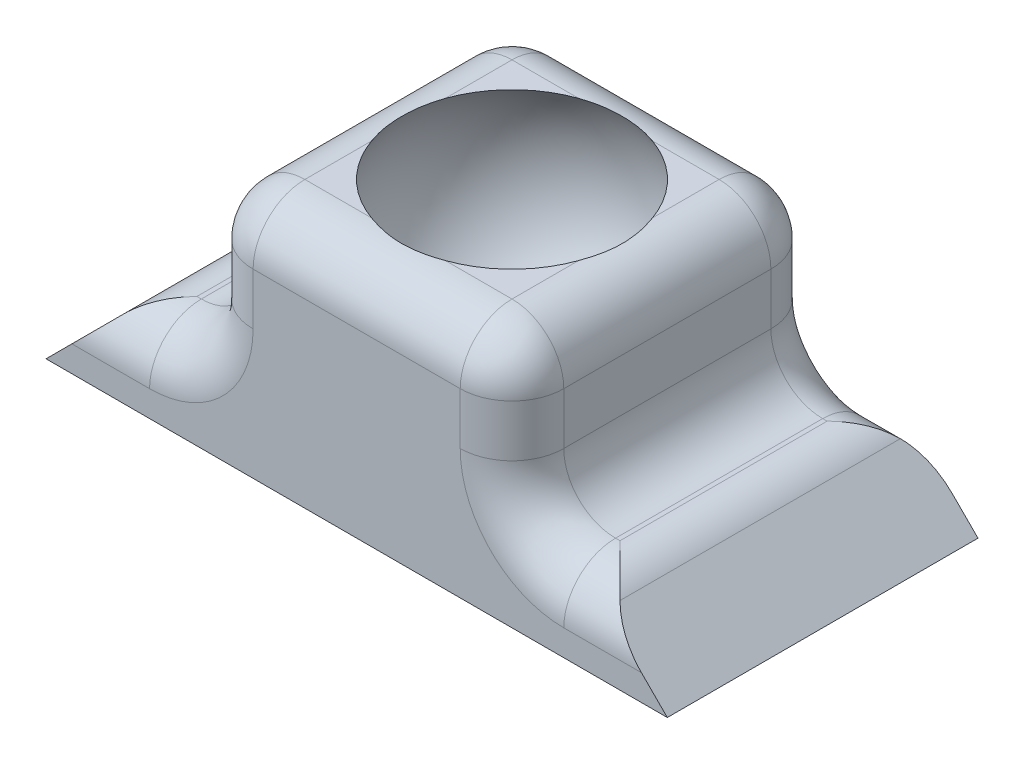
ISO-10303-21;
HEADER;
FILE_DESCRIPTION(('STEP AP214'),'2;1');
FILE_NAME('part.step','',(''),(''),'','','');
FILE_SCHEMA(('AUTOMOTIVE_DESIGN { 1 0 10303 214 1 1 1 1 }'));
ENDSEC;
DATA;
#1=APPLICATION_CONTEXT('core data for automotive mechanical design processes');
#2=APPLICATION_PROTOCOL_DEFINITION('international standard','automotive_design',2000,#1);
#3=PRODUCT_CONTEXT('',#1,'mechanical');
#4=PRODUCT('Part','Part','',(#3));
#5=PRODUCT_RELATED_PRODUCT_CATEGORY('part','',(#4));
#6=PRODUCT_DEFINITION_FORMATION('','',#4);
#7=PRODUCT_DEFINITION_CONTEXT('part definition',#1,'design');
#8=PRODUCT_DEFINITION('design','',#6,#7);
#9=PRODUCT_DEFINITION_SHAPE('','',#8);
#10=(LENGTH_UNIT() NAMED_UNIT(*) SI_UNIT(.MILLI.,.METRE.));
#11=(NAMED_UNIT(*) PLANE_ANGLE_UNIT() SI_UNIT($,.RADIAN.));
#12=(NAMED_UNIT(*) SI_UNIT($,.STERADIAN.) SOLID_ANGLE_UNIT());
#13=UNCERTAINTY_MEASURE_WITH_UNIT(LENGTH_MEASURE(1.E-05),#10,'distance_accuracy_value','');
#14=(GEOMETRIC_REPRESENTATION_CONTEXT(3) GLOBAL_UNCERTAINTY_ASSIGNED_CONTEXT((#13)) GLOBAL_UNIT_ASSIGNED_CONTEXT((#10,
#11,#12)) REPRESENTATION_CONTEXT('',''));
#15=CARTESIAN_POINT('',(0.,0.,0.));
#16=DIRECTION('',(0.,0.,1.));
#17=DIRECTION('',(1.,0.,0.));
#18=AXIS2_PLACEMENT_3D('',#15,#16,#17);
#19=CARTESIAN_POINT('',(0.,4.5,-3.));
#20=DIRECTION('',(0.,-1.,0.));
#21=DIRECTION('',(0.,0.,-1.));
#22=AXIS2_PLACEMENT_3D('',#19,#20,#21);
#23=PLANE('',#22);
#24=CARTESIAN_POINT('',(0.,4.5,0.));
#25=DIRECTION('',(0.,-1.,0.));
#26=DIRECTION('',(0.,0.,-1.));
#27=AXIS2_PLACEMENT_3D('',#24,#25,#26);
#28=CIRCLE('',#27,2.12367605815953);
#29=CARTESIAN_POINT('',(2.,4.5,-0.714142842854288));
#30=VERTEX_POINT('',#29);
#31=CARTESIAN_POINT('',(0.714142842854288,4.5,-2.));
#32=VERTEX_POINT('',#31);
#33=EDGE_CURVE('E248',#30,#32,#28,.F.);
#34=ORIENTED_EDGE('',*,*,#33,.F.);
#35=DIRECTION('',(0.,0.,1.));
#36=VECTOR('',#35,1.);
#37=CARTESIAN_POINT('',(2.,4.5,-3.));
#38=LINE('',#37,#36);
#39=CARTESIAN_POINT('',(2.,4.5,-2.));
#40=VERTEX_POINT('',#39);
#41=EDGE_CURVE('E56',#30,#40,#38,.F.);
#42=ORIENTED_EDGE('',*,*,#41,.T.);
#43=DIRECTION('',(1.,0.,0.));
#44=VECTOR('',#43,1.);
#45=CARTESIAN_POINT('',(0.,4.5,-2.));
#46=LINE('',#45,#44);
#47=EDGE_CURVE('E347',#40,#32,#46,.F.);
#48=ORIENTED_EDGE('',*,*,#47,.T.);
#49=EDGE_LOOP('',(#34,#42,#48));
#50=FACE_BOUND('',#49,.T.);
#51=ADVANCED_FACE('F39',(#50),#23,.F.);
#52=DIRECTION('',(1.,0.,0.));
#53=VECTOR('',#52,1.);
#54=CARTESIAN_POINT('',(3.,4.5,2.));
#55=LINE('',#54,#53);
#56=CARTESIAN_POINT('',(0.714142842854288,4.5,2.));
#57=VERTEX_POINT('',#56);
#58=CARTESIAN_POINT('',(2.,4.5,2.));
#59=VERTEX_POINT('',#58);
#60=EDGE_CURVE('E64',#57,#59,#55,.T.);
#61=ORIENTED_EDGE('',*,*,#60,.T.);
#62=DIRECTION('',(0.,0.,1.));
#63=VECTOR('',#62,1.);
#64=CARTESIAN_POINT('',(2.,4.5,-3.));
#65=LINE('',#64,#63);
#66=CARTESIAN_POINT('',(2.,4.5,0.714142842854288));
#67=VERTEX_POINT('',#66);
#68=EDGE_CURVE('E345',#59,#67,#65,.F.);
#69=ORIENTED_EDGE('',*,*,#68,.T.);
#70=EDGE_CURVE('E488',#57,#67,#28,.F.);
#71=ORIENTED_EDGE('',*,*,#70,.F.);
#72=EDGE_LOOP('',(#61,#69,#71));
#73=FACE_BOUND('',#72,.T.);
#74=ADVANCED_FACE('F531',(#73),#23,.F.);
#75=CARTESIAN_POINT('',(-0.714142842854288,4.5,-2.));
#76=VERTEX_POINT('',#75);
#77=CARTESIAN_POINT('',(-2.,4.5,-0.714142842854288));
#78=VERTEX_POINT('',#77);
#79=EDGE_CURVE('E243',#76,#78,#28,.F.);
#80=ORIENTED_EDGE('',*,*,#79,.F.);
#81=DIRECTION('',(1.,0.,0.));
#82=VECTOR('',#81,1.);
#83=CARTESIAN_POINT('',(0.,4.5,-2.));
#84=LINE('',#83,#82);
#85=CARTESIAN_POINT('',(-2.,4.5,-2.));
#86=VERTEX_POINT('',#85);
#87=EDGE_CURVE('E342',#76,#86,#84,.F.);
#88=ORIENTED_EDGE('',*,*,#87,.T.);
#89=DIRECTION('',(0.,0.,1.));
#90=VECTOR('',#89,1.);
#91=CARTESIAN_POINT('',(-2.,4.5,-3.));
#92=LINE('',#91,#90);
#93=EDGE_CURVE('E340',#86,#78,#92,.T.);
#94=ORIENTED_EDGE('',*,*,#93,.T.);
#95=EDGE_LOOP('',(#80,#88,#94));
#96=FACE_BOUND('',#95,.T.);
#97=ADVANCED_FACE('F507',(#96),#23,.F.);
#98=CARTESIAN_POINT('',(0.,0.,-3.));
#99=DIRECTION('',(0.,1.,0.));
#100=DIRECTION('',(0.,0.,1.));
#101=AXIS2_PLACEMENT_3D('',#98,#99,#100);
#102=PLANE('',#101);
#103=DIRECTION('',(0.,0.,1.));
#104=VECTOR('',#103,1.);
#105=CARTESIAN_POINT('',(6.,0.,-3.));
#106=LINE('',#105,#104);
#107=CARTESIAN_POINT('',(6.,0.,-3.));
#108=VERTEX_POINT('',#107);
#109=CARTESIAN_POINT('',(6.,0.,3.));
#110=VERTEX_POINT('',#109);
#111=EDGE_CURVE('E216',#108,#110,#106,.T.);
#112=ORIENTED_EDGE('',*,*,#111,.T.);
#113=DIRECTION('',(-1.,0.,0.));
#114=VECTOR('',#113,1.);
#115=CARTESIAN_POINT('',(0.,0.,3.));
#116=LINE('',#115,#114);
#117=CARTESIAN_POINT('',(-6.,0.,3.));
#118=VERTEX_POINT('',#117);
#119=EDGE_CURVE('E221',#110,#118,#116,.T.);
#120=ORIENTED_EDGE('',*,*,#119,.T.);
#121=DIRECTION('',(0.,0.,1.));
#122=VECTOR('',#121,1.);
#123=CARTESIAN_POINT('',(-6.,0.,-3.));
#124=LINE('',#123,#122);
#125=CARTESIAN_POINT('',(-6.,0.,-3.));
#126=VERTEX_POINT('',#125);
#127=EDGE_CURVE('E228',#126,#118,#124,.T.);
#128=ORIENTED_EDGE('',*,*,#127,.F.);
#129=DIRECTION('',(-1.,0.,0.));
#130=VECTOR('',#129,1.);
#131=CARTESIAN_POINT('',(0.,0.,-3.));
#132=LINE('',#131,#130);
#133=EDGE_CURVE('E224',#108,#126,#132,.T.);
#134=ORIENTED_EDGE('',*,*,#133,.F.);
#135=EDGE_LOOP('',(#112,#120,#128,#134));
#136=FACE_BOUND('',#135,.T.);
#137=ADVANCED_FACE('F218',(#136),#102,.F.);
#138=CARTESIAN_POINT('',(-2.99999999999997,3.,-3.));
#139=DIRECTION('',(0.707106781186544,-0.707106781186551,0.));
#140=DIRECTION('',(0.707106781186551,0.707106781186544,0.));
#141=AXIS2_PLACEMENT_3D('',#138,#139,#140);
#142=PLANE('',#141);
#143=DIRECTION('',(0.707106781186551,0.707106781186544,0.));
#144=VECTOR('',#143,1.);
#145=CARTESIAN_POINT('',(-2.99999999999997,3.,3.));
#146=LINE('',#145,#144);
#147=CARTESIAN_POINT('',(-5.5,0.499999999999998,3.));
#148=VERTEX_POINT('',#147);
#149=EDGE_CURVE('E238',#118,#148,#146,.T.);
#150=ORIENTED_EDGE('',*,*,#149,.T.);
#151=CARTESIAN_POINT('',(-5.5,0.499999999999999,2.));
#152=DIRECTION('',(0.707106781186544,-0.707106781186551,0.));
#153=DIRECTION('',(-0.707106781186551,-0.707106781186544,0.));
#154=AXIS2_PLACEMENT_3D('',#151,#152,#153);
#155=ELLIPSE('',#154,1.4142135623731,1.);
#156=CARTESIAN_POINT('',(-4.79289321881344,1.20710678118655,2.70710678118654));
#157=VERTEX_POINT('',#156);
#158=EDGE_CURVE('E286',#148,#157,#155,.F.);
#159=ORIENTED_EDGE('',*,*,#158,.T.);
#160=DIRECTION('',(0.,0.,1.));
#161=VECTOR('',#160,1.);
#162=CARTESIAN_POINT('',(-4.79289321881344,1.20710678118655,-3.));
#163=LINE('',#162,#161);
#164=CARTESIAN_POINT('',(-4.79289321881344,1.20710678118655,-2.70710678118654));
#165=VERTEX_POINT('',#164);
#166=EDGE_CURVE('E282',#157,#165,#163,.F.);
#167=ORIENTED_EDGE('',*,*,#166,.T.);
#168=CARTESIAN_POINT('',(-5.5,0.499999999999999,-2.));
#169=DIRECTION('',(0.707106781186544,-0.707106781186551,0.));
#170=DIRECTION('',(0.707106781186551,0.707106781186544,0.));
#171=AXIS2_PLACEMENT_3D('',#168,#169,#170);
#172=ELLIPSE('',#171,1.4142135623731,1.);
#173=CARTESIAN_POINT('',(-5.5,0.499999999999998,-3.));
#174=VERTEX_POINT('',#173);
#175=EDGE_CURVE('E284',#165,#174,#172,.F.);
#176=ORIENTED_EDGE('',*,*,#175,.T.);
#177=DIRECTION('',(0.707106781186551,0.707106781186544,0.));
#178=VECTOR('',#177,1.);
#179=CARTESIAN_POINT('',(-2.99999999999997,3.,-3.));
#180=LINE('',#179,#178);
#181=EDGE_CURVE('E229',#126,#174,#180,.T.);
#182=ORIENTED_EDGE('',*,*,#181,.F.);
#183=ORIENTED_EDGE('',*,*,#127,.T.);
#184=EDGE_LOOP('',(#150,#159,#167,#176,#182,#183));
#185=FACE_BOUND('',#184,.T.);
#186=ADVANCED_FACE('F537',(#185),#142,.F.);
#187=CARTESIAN_POINT('',(0.,1.5,-3.));
#188=DIRECTION('',(0.,-1.,0.));
#189=DIRECTION('',(1.,0.,0.));
#190=AXIS2_PLACEMENT_3D('',#187,#188,#189);
#191=PLANE('',#190);
#192=DIRECTION('',(1.,0.,0.));
#193=VECTOR('',#192,1.);
#194=CARTESIAN_POINT('',(0.,1.5,-2.));
#195=LINE('',#194,#193);
#196=CARTESIAN_POINT('',(-4.,1.5,-2.));
#197=VERTEX_POINT('',#196);
#198=CARTESIAN_POINT('',(-4.08578643762689,1.5,-2.));
#199=VERTEX_POINT('',#198);
#200=EDGE_CURVE('E259',#197,#199,#195,.F.);
#201=ORIENTED_EDGE('',*,*,#200,.T.);
#202=DIRECTION('',(0.,0.,1.));
#203=VECTOR('',#202,1.);
#204=CARTESIAN_POINT('',(-4.08578643762689,1.5,-3.));
#205=LINE('',#204,#203);
#206=CARTESIAN_POINT('',(-4.08578643762689,1.5,2.));
#207=VERTEX_POINT('',#206);
#208=EDGE_CURVE('E264',#199,#207,#205,.T.);
#209=ORIENTED_EDGE('',*,*,#208,.T.);
#210=DIRECTION('',(1.,0.,0.));
#211=VECTOR('',#210,1.);
#212=CARTESIAN_POINT('',(-3.,1.5,2.));
#213=LINE('',#212,#211);
#214=CARTESIAN_POINT('',(-4.,1.5,2.));
#215=VERTEX_POINT('',#214);
#216=EDGE_CURVE('E261',#207,#215,#213,.T.);
#217=ORIENTED_EDGE('',*,*,#216,.T.);
#218=DIRECTION('',(0.,0.,1.));
#219=VECTOR('',#218,1.);
#220=CARTESIAN_POINT('',(-4.,1.5,-3.));
#221=LINE('',#220,#219);
#222=EDGE_CURVE('E256',#215,#197,#221,.F.);
#223=ORIENTED_EDGE('',*,*,#222,.T.);
#224=EDGE_LOOP('',(#201,#209,#217,#223));
#225=FACE_BOUND('',#224,.T.);
#226=ADVANCED_FACE('F527',(#225),#191,.F.);
#227=CARTESIAN_POINT('',(-3.,0.,-3.));
#228=DIRECTION('',(1.,0.,0.));
#229=DIRECTION('',(0.,0.,-1.));
#230=AXIS2_PLACEMENT_3D('',#227,#228,#229);
#231=PLANE('',#230);
#232=DIRECTION('',(0.,1.,0.));
#233=VECTOR('',#232,1.);
#234=CARTESIAN_POINT('',(-3.,0.,-2.));
#235=LINE('',#234,#233);
#236=CARTESIAN_POINT('',(-3.,3.5,-2.));
#237=VERTEX_POINT('',#236);
#238=CARTESIAN_POINT('',(-3.,2.5,-2.));
#239=VERTEX_POINT('',#238);
#240=EDGE_CURVE('E320',#237,#239,#235,.F.);
#241=ORIENTED_EDGE('',*,*,#240,.T.);
#242=DIRECTION('',(0.,0.,1.));
#243=VECTOR('',#242,1.);
#244=CARTESIAN_POINT('',(-3.,2.5,3.));
#245=LINE('',#244,#243);
#246=CARTESIAN_POINT('',(-3.,2.5,2.));
#247=VERTEX_POINT('',#246);
#248=EDGE_CURVE('E325',#239,#247,#245,.T.);
#249=ORIENTED_EDGE('',*,*,#248,.T.);
#250=DIRECTION('',(0.,1.,0.));
#251=VECTOR('',#250,1.);
#252=CARTESIAN_POINT('',(-3.,4.5,2.));
#253=LINE('',#252,#251);
#254=CARTESIAN_POINT('',(-3.,3.5,2.));
#255=VERTEX_POINT('',#254);
#256=EDGE_CURVE('E322',#247,#255,#253,.T.);
#257=ORIENTED_EDGE('',*,*,#256,.T.);
#258=DIRECTION('',(0.,0.,1.));
#259=VECTOR('',#258,1.);
#260=CARTESIAN_POINT('',(-3.,3.5,-3.));
#261=LINE('',#260,#259);
#262=EDGE_CURVE('E318',#255,#237,#261,.F.);
#263=ORIENTED_EDGE('',*,*,#262,.T.);
#264=EDGE_LOOP('',(#241,#249,#257,#263));
#265=FACE_BOUND('',#264,.T.);
#266=ADVANCED_FACE('F518',(#265),#231,.F.);
#267=DIRECTION('',(0.,0.,1.));
#268=VECTOR('',#267,1.);
#269=CARTESIAN_POINT('',(-2.,4.5,-3.));
#270=LINE('',#269,#268);
#271=CARTESIAN_POINT('',(-2.,4.5,0.714142842854288));
#272=VERTEX_POINT('',#271);
#273=CARTESIAN_POINT('',(-2.,4.5,2.));
#274=VERTEX_POINT('',#273);
#275=EDGE_CURVE('E336',#272,#274,#270,.T.);
#276=ORIENTED_EDGE('',*,*,#275,.T.);
#277=DIRECTION('',(1.,0.,0.));
#278=VECTOR('',#277,1.);
#279=CARTESIAN_POINT('',(3.,4.5,2.));
#280=LINE('',#279,#278);
#281=CARTESIAN_POINT('',(-0.714142842854288,4.5,2.));
#282=VERTEX_POINT('',#281);
#283=EDGE_CURVE('E338',#274,#282,#280,.T.);
#284=ORIENTED_EDGE('',*,*,#283,.T.);
#285=EDGE_CURVE('E246',#272,#282,#28,.F.);
#286=ORIENTED_EDGE('',*,*,#285,.F.);
#287=EDGE_LOOP('',(#276,#284,#286));
#288=FACE_BOUND('',#287,.T.);
#289=ADVANCED_FACE('F515',(#288),#23,.F.);
#290=CARTESIAN_POINT('',(3.,0.,-3.));
#291=DIRECTION('',(1.,0.,0.));
#292=DIRECTION('',(0.,0.,-1.));
#293=AXIS2_PLACEMENT_3D('',#290,#291,#292);
#294=PLANE('',#293);
#295=DIRECTION('',(0.,1.,0.));
#296=VECTOR('',#295,1.);
#297=CARTESIAN_POINT('',(3.,0.,2.));
#298=LINE('',#297,#296);
#299=CARTESIAN_POINT('',(3.,3.5,2.));
#300=VERTEX_POINT('',#299);
#301=CARTESIAN_POINT('',(3.,2.5,2.));
#302=VERTEX_POINT('',#301);
#303=EDGE_CURVE('E331',#300,#302,#298,.F.);
#304=ORIENTED_EDGE('',*,*,#303,.T.);
#305=DIRECTION('',(0.,0.,1.));
#306=VECTOR('',#305,1.);
#307=CARTESIAN_POINT('',(3.,2.5,-3.));
#308=LINE('',#307,#306);
#309=CARTESIAN_POINT('',(3.,2.5,-2.));
#310=VERTEX_POINT('',#309);
#311=EDGE_CURVE('E334',#302,#310,#308,.F.);
#312=ORIENTED_EDGE('',*,*,#311,.T.);
#313=DIRECTION('',(0.,1.,0.));
#314=VECTOR('',#313,1.);
#315=CARTESIAN_POINT('',(3.,4.5,-2.));
#316=LINE('',#315,#314);
#317=CARTESIAN_POINT('',(3.,3.5,-2.));
#318=VERTEX_POINT('',#317);
#319=EDGE_CURVE('E329',#310,#318,#316,.T.);
#320=ORIENTED_EDGE('',*,*,#319,.T.);
#321=DIRECTION('',(0.,0.,1.));
#322=VECTOR('',#321,1.);
#323=CARTESIAN_POINT('',(3.,3.5,3.));
#324=LINE('',#323,#322);
#325=EDGE_CURVE('E327',#318,#300,#324,.T.);
#326=ORIENTED_EDGE('',*,*,#325,.T.);
#327=EDGE_LOOP('',(#304,#312,#320,#326));
#328=FACE_BOUND('',#327,.T.);
#329=ADVANCED_FACE('F517',(#328),#294,.T.);
#330=CARTESIAN_POINT('',(0.,1.5,-3.));
#331=DIRECTION('',(0.,1.,0.));
#332=DIRECTION('',(0.,0.,1.));
#333=AXIS2_PLACEMENT_3D('',#330,#331,#332);
#334=PLANE('',#333);
#335=DIRECTION('',(-1.,0.,0.));
#336=VECTOR('',#335,1.);
#337=CARTESIAN_POINT('',(0.,1.5,2.));
#338=LINE('',#337,#336);
#339=CARTESIAN_POINT('',(4.,1.5,2.));
#340=VERTEX_POINT('',#339);
#341=CARTESIAN_POINT('',(4.08578643762689,1.5,2.));
#342=VERTEX_POINT('',#341);
#343=EDGE_CURVE('E292',#340,#342,#338,.F.);
#344=ORIENTED_EDGE('',*,*,#343,.T.);
#345=DIRECTION('',(0.,0.,1.));
#346=VECTOR('',#345,1.);
#347=CARTESIAN_POINT('',(4.08578643762689,1.5,-3.));
#348=LINE('',#347,#346);
#349=CARTESIAN_POINT('',(4.08578643762689,1.5,-2.));
#350=VERTEX_POINT('',#349);
#351=EDGE_CURVE('E295',#342,#350,#348,.F.);
#352=ORIENTED_EDGE('',*,*,#351,.T.);
#353=DIRECTION('',(-1.,0.,0.));
#354=VECTOR('',#353,1.);
#355=CARTESIAN_POINT('',(3.,1.5,-2.));
#356=LINE('',#355,#354);
#357=CARTESIAN_POINT('',(4.,1.5,-2.));
#358=VERTEX_POINT('',#357);
#359=EDGE_CURVE('E290',#350,#358,#356,.T.);
#360=ORIENTED_EDGE('',*,*,#359,.T.);
#361=DIRECTION('',(0.,0.,1.));
#362=VECTOR('',#361,1.);
#363=CARTESIAN_POINT('',(4.,1.5,3.));
#364=LINE('',#363,#362);
#365=EDGE_CURVE('E288',#358,#340,#364,.T.);
#366=ORIENTED_EDGE('',*,*,#365,.T.);
#367=EDGE_LOOP('',(#344,#352,#360,#366));
#368=FACE_BOUND('',#367,.T.);
#369=ADVANCED_FACE('F524',(#368),#334,.T.);
#370=CARTESIAN_POINT('',(2.99999999999997,3.,-3.));
#371=DIRECTION('',(0.707106781186544,0.707106781186551,0.));
#372=DIRECTION('',(-0.707106781186551,0.707106781186544,0.));
#373=AXIS2_PLACEMENT_3D('',#370,#371,#372);
#374=PLANE('',#373);
#375=DIRECTION('',(0.,0.,1.));
#376=VECTOR('',#375,1.);
#377=CARTESIAN_POINT('',(4.79289321881344,1.20710678118655,-3.));
#378=LINE('',#377,#376);
#379=CARTESIAN_POINT('',(4.79289321881344,1.20710678118655,-2.70710678118654));
#380=VERTEX_POINT('',#379);
#381=CARTESIAN_POINT('',(4.79289321881344,1.20710678118655,2.70710678118654));
#382=VERTEX_POINT('',#381);
#383=EDGE_CURVE('E297',#380,#382,#378,.T.);
#384=ORIENTED_EDGE('',*,*,#383,.T.);
#385=CARTESIAN_POINT('',(5.49999999999999,0.499999999999999,2.));
#386=DIRECTION('',(0.707106781186544,0.707106781186551,0.));
#387=DIRECTION('',(-0.707106781186551,0.707106781186544,0.));
#388=AXIS2_PLACEMENT_3D('',#385,#386,#387);
#389=ELLIPSE('',#388,1.4142135623731,1.);
#390=CARTESIAN_POINT('',(5.49999999999999,0.499999999999999,3.));
#391=VERTEX_POINT('',#390);
#392=EDGE_CURVE('E235',#382,#391,#389,.T.);
#393=ORIENTED_EDGE('',*,*,#392,.T.);
#394=DIRECTION('',(-0.707106781186551,0.707106781186544,0.));
#395=VECTOR('',#394,1.);
#396=CARTESIAN_POINT('',(2.99999999999997,3.,3.));
#397=LINE('',#396,#395);
#398=EDGE_CURVE('E232',#110,#391,#397,.T.);
#399=ORIENTED_EDGE('',*,*,#398,.F.);
#400=ORIENTED_EDGE('',*,*,#111,.F.);
#401=DIRECTION('',(-0.707106781186551,0.707106781186544,0.));
#402=VECTOR('',#401,1.);
#403=CARTESIAN_POINT('',(2.99999999999997,3.,-3.));
#404=LINE('',#403,#402);
#405=CARTESIAN_POINT('',(5.49999999999999,0.499999999999999,-3.));
#406=VERTEX_POINT('',#405);
#407=EDGE_CURVE('E252',#108,#406,#404,.T.);
#408=ORIENTED_EDGE('',*,*,#407,.T.);
#409=CARTESIAN_POINT('',(5.49999999999999,0.499999999999999,-2.));
#410=DIRECTION('',(0.707106781186544,0.707106781186551,0.));
#411=DIRECTION('',(0.707106781186551,-0.707106781186544,0.));
#412=AXIS2_PLACEMENT_3D('',#409,#410,#411);
#413=ELLIPSE('',#412,1.4142135623731,1.);
#414=EDGE_CURVE('E299',#406,#380,#413,.T.);
#415=ORIENTED_EDGE('',*,*,#414,.T.);
#416=EDGE_LOOP('',(#384,#393,#399,#400,#408,#415));
#417=FACE_BOUND('',#416,.T.);
#418=ADVANCED_FACE('F233',(#417),#374,.T.);
#419=CARTESIAN_POINT('',(0.,0.,-3.));
#420=DIRECTION('',(0.,0.,1.));
#421=DIRECTION('',(1.,0.,0.));
#422=AXIS2_PLACEMENT_3D('',#419,#420,#421);
#423=PLANE('',#422);
#424=CARTESIAN_POINT('',(4.,2.5,-3.));
#425=DIRECTION('',(0.,0.,1.));
#426=DIRECTION('',(1.,0.,0.));
#427=AXIS2_PLACEMENT_3D('',#424,#425,#426);
#428=CIRCLE('',#427,2.);
#429=CARTESIAN_POINT('',(4.,0.499999999999999,-3.));
#430=VERTEX_POINT('',#429);
#431=CARTESIAN_POINT('',(2.,2.5,-3.));
#432=VERTEX_POINT('',#431);
#433=EDGE_CURVE('E313',#430,#432,#428,.F.);
#434=ORIENTED_EDGE('',*,*,#433,.F.);
#435=DIRECTION('',(-1.,0.,0.));
#436=VECTOR('',#435,1.);
#437=CARTESIAN_POINT('',(4.49999999999998,0.499999999999999,-3.));
#438=LINE('',#437,#436);
#439=EDGE_CURVE('E316',#430,#406,#438,.F.);
#440=ORIENTED_EDGE('',*,*,#439,.T.);
#441=ORIENTED_EDGE('',*,*,#407,.F.);
#442=ORIENTED_EDGE('',*,*,#133,.T.);
#443=ORIENTED_EDGE('',*,*,#181,.T.);
#444=DIRECTION('',(1.,0.,0.));
#445=VECTOR('',#444,1.);
#446=CARTESIAN_POINT('',(0.,0.5,-3.));
#447=LINE('',#446,#445);
#448=CARTESIAN_POINT('',(-4.,0.499999999999999,-3.));
#449=VERTEX_POINT('',#448);
#450=EDGE_CURVE('E311',#174,#449,#447,.T.);
#451=ORIENTED_EDGE('',*,*,#450,.T.);
#452=CARTESIAN_POINT('',(-4.,2.5,-3.));
#453=DIRECTION('',(0.,0.,1.));
#454=DIRECTION('',(1.,0.,0.));
#455=AXIS2_PLACEMENT_3D('',#452,#453,#454);
#456=CIRCLE('',#455,2.);
#457=CARTESIAN_POINT('',(-2.,2.5,-3.));
#458=VERTEX_POINT('',#457);
#459=EDGE_CURVE('E308',#458,#449,#456,.F.);
#460=ORIENTED_EDGE('',*,*,#459,.F.);
#461=DIRECTION('',(0.,1.,0.));
#462=VECTOR('',#461,1.);
#463=CARTESIAN_POINT('',(-2.,0.,-3.));
#464=LINE('',#463,#462);
#465=CARTESIAN_POINT('',(-2.,3.5,-3.));
#466=VERTEX_POINT('',#465);
#467=EDGE_CURVE('E304',#458,#466,#464,.T.);
#468=ORIENTED_EDGE('',*,*,#467,.T.);
#469=DIRECTION('',(1.,0.,0.));
#470=VECTOR('',#469,1.);
#471=CARTESIAN_POINT('',(0.,3.5,-3.));
#472=LINE('',#471,#470);
#473=CARTESIAN_POINT('',(2.,3.5,-3.));
#474=VERTEX_POINT('',#473);
#475=EDGE_CURVE('E302',#466,#474,#472,.T.);
#476=ORIENTED_EDGE('',*,*,#475,.T.);
#477=DIRECTION('',(0.,1.,0.));
#478=VECTOR('',#477,1.);
#479=CARTESIAN_POINT('',(2.,1.5,-3.));
#480=LINE('',#479,#478);
#481=EDGE_CURVE('E306',#474,#432,#480,.F.);
#482=ORIENTED_EDGE('',*,*,#481,.T.);
#483=EDGE_LOOP('',(#434,#440,#441,#442,#443,#451,#460,#468,#476,#482));
#484=FACE_BOUND('',#483,.T.);
#485=ADVANCED_FACE('F600',(#484),#423,.F.);
#486=CARTESIAN_POINT('',(0.,0.,3.));
#487=DIRECTION('',(0.,0.,1.));
#488=DIRECTION('',(1.,0.,0.));
#489=AXIS2_PLACEMENT_3D('',#486,#487,#488);
#490=PLANE('',#489);
#491=CARTESIAN_POINT('',(-4.,2.5,3.));
#492=DIRECTION('',(0.,0.,1.));
#493=DIRECTION('',(1.,0.,0.));
#494=AXIS2_PLACEMENT_3D('',#491,#492,#493);
#495=CIRCLE('',#494,2.);
#496=CARTESIAN_POINT('',(-4.,0.499999999999999,3.));
#497=VERTEX_POINT('',#496);
#498=CARTESIAN_POINT('',(-2.,2.5,3.));
#499=VERTEX_POINT('',#498);
#500=EDGE_CURVE('E277',#497,#499,#495,.T.);
#501=ORIENTED_EDGE('',*,*,#500,.F.);
#502=DIRECTION('',(1.,0.,0.));
#503=VECTOR('',#502,1.);
#504=CARTESIAN_POINT('',(-4.49999999999998,0.499999999999999,3.));
#505=LINE('',#504,#503);
#506=EDGE_CURVE('E280',#497,#148,#505,.F.);
#507=ORIENTED_EDGE('',*,*,#506,.T.);
#508=ORIENTED_EDGE('',*,*,#149,.F.);
#509=ORIENTED_EDGE('',*,*,#119,.F.);
#510=ORIENTED_EDGE('',*,*,#398,.T.);
#511=DIRECTION('',(-1.,0.,0.));
#512=VECTOR('',#511,1.);
#513=CARTESIAN_POINT('',(0.,0.499999999999999,3.));
#514=LINE('',#513,#512);
#515=CARTESIAN_POINT('',(4.,0.499999999999999,3.));
#516=VERTEX_POINT('',#515);
#517=EDGE_CURVE('E275',#391,#516,#514,.T.);
#518=ORIENTED_EDGE('',*,*,#517,.T.);
#519=CARTESIAN_POINT('',(4.,2.5,3.));
#520=DIRECTION('',(0.,0.,1.));
#521=DIRECTION('',(1.,0.,0.));
#522=AXIS2_PLACEMENT_3D('',#519,#520,#521);
#523=CIRCLE('',#522,2.);
#524=CARTESIAN_POINT('',(2.,2.5,3.));
#525=VERTEX_POINT('',#524);
#526=EDGE_CURVE('E272',#525,#516,#523,.T.);
#527=ORIENTED_EDGE('',*,*,#526,.F.);
#528=DIRECTION('',(0.,1.,0.));
#529=VECTOR('',#528,1.);
#530=CARTESIAN_POINT('',(2.,0.,3.));
#531=LINE('',#530,#529);
#532=CARTESIAN_POINT('',(2.,3.5,3.));
#533=VERTEX_POINT('',#532);
#534=EDGE_CURVE('E268',#525,#533,#531,.T.);
#535=ORIENTED_EDGE('',*,*,#534,.T.);
#536=DIRECTION('',(1.,0.,0.));
#537=VECTOR('',#536,1.);
#538=CARTESIAN_POINT('',(-3.,3.5,3.));
#539=LINE('',#538,#537);
#540=CARTESIAN_POINT('',(-2.,3.5,3.));
#541=VERTEX_POINT('',#540);
#542=EDGE_CURVE('E266',#533,#541,#539,.F.);
#543=ORIENTED_EDGE('',*,*,#542,.T.);
#544=DIRECTION('',(0.,1.,0.));
#545=VECTOR('',#544,1.);
#546=CARTESIAN_POINT('',(-2.,1.5,3.));
#547=LINE('',#546,#545);
#548=EDGE_CURVE('E270',#541,#499,#547,.F.);
#549=ORIENTED_EDGE('',*,*,#548,.T.);
#550=EDGE_LOOP('',(#501,#507,#508,#509,#510,#518,#527,#535,#543,#549));
#551=FACE_BOUND('',#550,.T.);
#552=ADVANCED_FACE('F240',(#551),#490,.T.);
#553=CARTESIAN_POINT('',(0.,3.,0.));
#554=DIRECTION('',(0.,-1.,0.));
#555=DIRECTION('',(0.,0.,1.));
#556=AXIS2_PLACEMENT_3D('',#553,#554,#555);
#557=SPHERICAL_SURFACE('',#556,2.6);
#558=ORIENTED_EDGE('',*,*,#70,.T.);
#559=CARTESIAN_POINT('',(2.,4.5,0.714142842854288));
#560=CARTESIAN_POINT('',(2.02120856488097,4.49998181518581,0.654811966917709));
#561=CARTESIAN_POINT('',(2.04019862935991,4.49932240744275,0.594646415412867));
#562=CARTESIAN_POINT('',(2.07315764417485,4.49746260628838,0.4728645823345));
#563=CARTESIAN_POINT('',(2.08711838133541,4.49626133512233,0.411246101280832));
#564=CARTESIAN_POINT('',(2.10900456752699,4.49409943749816,0.288967198413848));
#565=CARTESIAN_POINT('',(2.11710941306614,4.49313232258627,0.228339543813259));
#566=CARTESIAN_POINT('',(2.127622255806,4.49183780497763,0.106632695751968));
#567=CARTESIAN_POINT('',(2.13003534581324,4.49150983044357,0.045553955043869));
#568=CARTESIAN_POINT('',(2.12907786545676,4.49163423915231,-0.0740551122687778));
#569=CARTESIAN_POINT('',(2.12593983131246,4.49205525154802,-0.132587486612791));
#570=CARTESIAN_POINT('',(2.11446770932147,4.49344322809918,-0.249175162260622));
#571=CARTESIAN_POINT('',(2.10612952086886,4.49441062305028,-0.307230050401004));
#572=CARTESIAN_POINT('',(2.08425855171994,4.49650689458196,-0.424250378467779));
#573=CARTESIAN_POINT('',(2.0705688379247,4.49763993180131,-0.483185960878591));
#574=CARTESIAN_POINT('',(2.03859230853282,4.49937881388076,-0.599714448654027));
#575=CARTESIAN_POINT('',(2.02031242939241,4.49998544810955,-0.657309237942936));
#576=CARTESIAN_POINT('',(2.,4.5,-0.714142842854288));
#577=B_SPLINE_CURVE_WITH_KNOTS('',3,(#559,#560,#561,#562,#563,#564,#565,#566,#567,#568,#569,
#570,#571,#572,#573,#574,#575,#576),.UNSPECIFIED.,.F.,.F.,(4,2,2,2,2,2,2,2,4),(0.,
0.189037640665475,0.378382605823105,0.561647790603665,0.744748933065188,0.920360545520979,
1.09611081273155,1.27745660732208,1.45852999217182),.UNSPECIFIED.);
#578=EDGE_CURVE('E11',#67,#30,#577,.T.);
#579=ORIENTED_EDGE('',*,*,#578,.T.);
#580=ORIENTED_EDGE('',*,*,#33,.T.);
#581=CARTESIAN_POINT('',(0.714142842854288,4.5,-2.));
#582=CARTESIAN_POINT('',(0.654811966917709,4.49998181518581,-2.02120856488097));
#583=CARTESIAN_POINT('',(0.594646415412867,4.49932240744275,-2.04019862935991));
#584=CARTESIAN_POINT('',(0.4728645823345,4.49746260628838,-2.07315764417485));
#585=CARTESIAN_POINT('',(0.411246101280832,4.49626133512233,-2.08711838133541));
#586=CARTESIAN_POINT('',(0.288967198413848,4.49409943749816,-2.10900456752699));
#587=CARTESIAN_POINT('',(0.228339543813259,4.49313232258627,-2.11710941306614));
#588=CARTESIAN_POINT('',(0.106632695751968,4.49183780497763,-2.127622255806));
#589=CARTESIAN_POINT('',(0.045553955043869,4.49150983044357,-2.13003534581324));
#590=CARTESIAN_POINT('',(-0.0740551122687777,4.49163423915231,-2.12907786545676));
#591=CARTESIAN_POINT('',(-0.132587486612791,4.49205525154802,-2.12593983131246));
#592=CARTESIAN_POINT('',(-0.249175162260622,4.49344322809918,-2.11446770932147));
#593=CARTESIAN_POINT('',(-0.307230050401004,4.49441062305028,-2.10612952086886));
#594=CARTESIAN_POINT('',(-0.424250378467779,4.49650689458196,-2.08425855171994));
#595=CARTESIAN_POINT('',(-0.483185960878591,4.49763993180131,-2.0705688379247));
#596=CARTESIAN_POINT('',(-0.599714448654027,4.49937881388076,-2.03859230853282));
#597=CARTESIAN_POINT('',(-0.657309237942936,4.49998544810955,-2.02031242939241));
#598=CARTESIAN_POINT('',(-0.714142842854288,4.5,-2.));
#599=B_SPLINE_CURVE_WITH_KNOTS('',3,(#581,#582,#583,#584,#585,#586,#587,#588,#589,#590,#591,
#592,#593,#594,#595,#596,#597,#598),.UNSPECIFIED.,.F.,.F.,(4,2,2,2,2,2,2,2,4),(0.,
0.189037640665475,0.378382605823105,0.561647790603665,0.744748933065187,0.920360545520979,
1.09611081273155,1.27745660732208,1.45852999217182),.UNSPECIFIED.);
#600=EDGE_CURVE('E48',#32,#76,#599,.T.);
#601=ORIENTED_EDGE('',*,*,#600,.T.);
#602=ORIENTED_EDGE('',*,*,#79,.T.);
#603=CARTESIAN_POINT('',(-2.,4.5,-0.714142842854288));
#604=CARTESIAN_POINT('',(-2.02120856488097,4.49998181518581,-0.654811966917709));
#605=CARTESIAN_POINT('',(-2.04019862935991,4.49932240744275,-0.594646415412867));
#606=CARTESIAN_POINT('',(-2.07315764417485,4.49746260628838,-0.4728645823345));
#607=CARTESIAN_POINT('',(-2.08711838133541,4.49626133512233,-0.411246101280832));
#608=CARTESIAN_POINT('',(-2.10900456752699,4.49409943749816,-0.288967198413848));
#609=CARTESIAN_POINT('',(-2.11710941306614,4.49313232258627,-0.228339543813259));
#610=CARTESIAN_POINT('',(-2.127622255806,4.49183780497763,-0.106632695751968));
#611=CARTESIAN_POINT('',(-2.13003534581324,4.49150983044357,-0.045553955043869));
#612=CARTESIAN_POINT('',(-2.12907786545676,4.49163423915231,0.0740551122687778));
#613=CARTESIAN_POINT('',(-2.12593983131246,4.49205525154802,0.132587486612791));
#614=CARTESIAN_POINT('',(-2.11446770932147,4.49344322809918,0.249175162260622));
#615=CARTESIAN_POINT('',(-2.10612952086886,4.49441062305028,0.307230050401004));
#616=CARTESIAN_POINT('',(-2.08425855171994,4.49650689458196,0.424250378467779));
#617=CARTESIAN_POINT('',(-2.0705688379247,4.49763993180131,0.483185960878591));
#618=CARTESIAN_POINT('',(-2.03859230853282,4.49937881388076,0.599714448654027));
#619=CARTESIAN_POINT('',(-2.02031242939241,4.49998544810955,0.657309237942936));
#620=CARTESIAN_POINT('',(-2.,4.5,0.714142842854288));
#621=B_SPLINE_CURVE_WITH_KNOTS('',3,(#603,#604,#605,#606,#607,#608,#609,#610,#611,#612,#613,
#614,#615,#616,#617,#618,#619,#620),.UNSPECIFIED.,.F.,.F.,(4,2,2,2,2,2,2,2,4),(0.,
0.189037640665475,0.378382605823105,0.561647790603665,0.744748933065188,0.920360545520979,
1.09611081273155,1.27745660732208,1.45852999217182),.UNSPECIFIED.);
#622=EDGE_CURVE('E350',#78,#272,#621,.T.);
#623=ORIENTED_EDGE('',*,*,#622,.T.);
#624=ORIENTED_EDGE('',*,*,#285,.T.);
#625=CARTESIAN_POINT('',(-0.714142842854288,4.5,2.));
#626=CARTESIAN_POINT('',(-0.654811966917709,4.49998181518581,2.02120856488097));
#627=CARTESIAN_POINT('',(-0.594646415412867,4.49932240744275,2.04019862935991));
#628=CARTESIAN_POINT('',(-0.4728645823345,4.49746260628838,2.07315764417485));
#629=CARTESIAN_POINT('',(-0.411246101280832,4.49626133512233,2.08711838133541));
#630=CARTESIAN_POINT('',(-0.288967198413848,4.49409943749816,2.10900456752699));
#631=CARTESIAN_POINT('',(-0.228339543813259,4.49313232258627,2.11710941306614));
#632=CARTESIAN_POINT('',(-0.106632695751968,4.49183780497763,2.127622255806));
#633=CARTESIAN_POINT('',(-0.045553955043869,4.49150983044357,2.13003534581324));
#634=CARTESIAN_POINT('',(0.0740551122687777,4.49163423915231,2.12907786545676));
#635=CARTESIAN_POINT('',(0.132587486612791,4.49205525154802,2.12593983131246));
#636=CARTESIAN_POINT('',(0.249175162260622,4.49344322809918,2.11446770932147));
#637=CARTESIAN_POINT('',(0.307230050401004,4.49441062305028,2.10612952086886));
#638=CARTESIAN_POINT('',(0.424250378467779,4.49650689458196,2.08425855171994));
#639=CARTESIAN_POINT('',(0.483185960878591,4.49763993180131,2.0705688379247));
#640=CARTESIAN_POINT('',(0.599714448654027,4.49937881388076,2.03859230853282));
#641=CARTESIAN_POINT('',(0.657309237942936,4.49998544810955,2.02031242939241));
#642=CARTESIAN_POINT('',(0.714142842854288,4.5,2.));
#643=B_SPLINE_CURVE_WITH_KNOTS('',3,(#625,#626,#627,#628,#629,#630,#631,#632,#633,#634,#635,
#636,#637,#638,#639,#640,#641,#642),.UNSPECIFIED.,.F.,.F.,(4,2,2,2,2,2,2,2,4),(0.,
0.189037640665475,0.378382605823105,0.561647790603665,0.744748933065187,0.920360545520979,
1.09611081273155,1.27745660732208,1.45852999217182),.UNSPECIFIED.);
#644=EDGE_CURVE('E357',#282,#57,#643,.T.);
#645=ORIENTED_EDGE('',*,*,#644,.T.);
#646=EDGE_LOOP('',(#558,#579,#580,#601,#602,#623,#624,#645));
#647=FACE_BOUND('',#646,.T.);
#648=ADVANCED_FACE('F363',(#647),#557,.F.);
#649=CARTESIAN_POINT('',(0.,0.499999999999999,-2.));
#650=DIRECTION('',(1.,0.,0.));
#651=DIRECTION('',(0.,0.,-1.));
#652=AXIS2_PLACEMENT_3D('',#649,#650,#651);
#653=CYLINDRICAL_SURFACE('',#652,1.);
#654=ORIENTED_EDGE('',*,*,#414,.F.);
#655=ORIENTED_EDGE('',*,*,#439,.F.);
#656=CARTESIAN_POINT('',(4.,0.499999999999999,-2.));
#657=DIRECTION('',(-1.,0.,0.));
#658=DIRECTION('',(0.,0.,1.));
#659=AXIS2_PLACEMENT_3D('',#656,#657,#658);
#660=CIRCLE('',#659,1.);
#661=EDGE_CURVE('E43',#358,#430,#660,.T.);
#662=ORIENTED_EDGE('',*,*,#661,.F.);
#663=ORIENTED_EDGE('',*,*,#359,.F.);
#664=CARTESIAN_POINT('',(4.08578643762689,0.499999999999999,-2.));
#665=DIRECTION('',(0.707106781186547,0.,0.707106781186547));
#666=DIRECTION('',(-0.707106781186547,0.,0.707106781186547));
#667=AXIS2_PLACEMENT_3D('',#664,#665,#666);
#668=ELLIPSE('',#667,1.41421356237309,1.);
#669=EDGE_CURVE('E477',#380,#350,#668,.T.);
#670=ORIENTED_EDGE('',*,*,#669,.F.);
#671=EDGE_LOOP('',(#654,#655,#662,#663,#670));
#672=FACE_BOUND('',#671,.T.);
#673=ADVANCED_FACE('F41',(#672),#653,.T.);
#674=CARTESIAN_POINT('',(4.,2.5,-2.));
#675=DIRECTION('',(0.,0.,1.));
#676=DIRECTION('',(1.,0.,0.));
#677=AXIS2_PLACEMENT_3D('',#674,#675,#676);
#678=TOROIDAL_SURFACE('',#677,2.,1.);
#679=ORIENTED_EDGE('',*,*,#661,.T.);
#680=ORIENTED_EDGE('',*,*,#433,.T.);
#681=CARTESIAN_POINT('',(2.,2.5,-2.));
#682=DIRECTION('',(0.,-1.,0.));
#683=DIRECTION('',(0.,0.,-1.));
#684=AXIS2_PLACEMENT_3D('',#681,#682,#683);
#685=CIRCLE('',#684,1.);
#686=EDGE_CURVE('E475',#310,#432,#685,.F.);
#687=ORIENTED_EDGE('',*,*,#686,.F.);
#688=CARTESIAN_POINT('',(4.,2.5,-2.));
#689=DIRECTION('',(0.,0.,1.));
#690=DIRECTION('',(1.,0.,0.));
#691=AXIS2_PLACEMENT_3D('',#688,#689,#690);
#692=CIRCLE('',#691,1.);
#693=EDGE_CURVE('E472',#358,#310,#692,.F.);
#694=ORIENTED_EDGE('',*,*,#693,.F.);
#695=EDGE_LOOP('',(#679,#680,#687,#694));
#696=FACE_BOUND('',#695,.T.);
#697=ADVANCED_FACE('F634',(#696),#678,.T.);
#698=CARTESIAN_POINT('',(4.08578643762689,0.499999999999999,-3.));
#699=DIRECTION('',(0.,0.,1.));
#700=DIRECTION('',(1.,0.,0.));
#701=AXIS2_PLACEMENT_3D('',#698,#699,#700);
#702=CYLINDRICAL_SURFACE('',#701,1.);
#703=ORIENTED_EDGE('',*,*,#669,.T.);
#704=ORIENTED_EDGE('',*,*,#351,.F.);
#705=CARTESIAN_POINT('',(4.08578643762689,0.499999999999999,2.));
#706=DIRECTION('',(-0.707106781186547,0.,0.707106781186547));
#707=DIRECTION('',(0.707106781186547,0.,0.707106781186547));
#708=AXIS2_PLACEMENT_3D('',#705,#706,#707);
#709=ELLIPSE('',#708,1.41421356237309,1.);
#710=EDGE_CURVE('E470',#382,#342,#709,.T.);
#711=ORIENTED_EDGE('',*,*,#710,.F.);
#712=ORIENTED_EDGE('',*,*,#383,.F.);
#713=EDGE_LOOP('',(#703,#704,#711,#712));
#714=FACE_BOUND('',#713,.T.);
#715=ADVANCED_FACE('F643',(#714),#702,.T.);
#716=CARTESIAN_POINT('',(2.,0.,-2.));
#717=DIRECTION('',(0.,-1.,0.));
#718=DIRECTION('',(0.,0.,-1.));
#719=AXIS2_PLACEMENT_3D('',#716,#717,#718);
#720=CYLINDRICAL_SURFACE('',#719,1.);
#721=ORIENTED_EDGE('',*,*,#686,.T.);
#722=ORIENTED_EDGE('',*,*,#481,.F.);
#723=CARTESIAN_POINT('',(2.,3.5,-2.));
#724=DIRECTION('',(0.,1.,0.));
#725=DIRECTION('',(0.,0.,1.));
#726=AXIS2_PLACEMENT_3D('',#723,#724,#725);
#727=CIRCLE('',#726,1.);
#728=EDGE_CURVE('E467',#318,#474,#727,.T.);
#729=ORIENTED_EDGE('',*,*,#728,.F.);
#730=ORIENTED_EDGE('',*,*,#319,.F.);
#731=EDGE_LOOP('',(#721,#722,#729,#730));
#732=FACE_BOUND('',#731,.T.);
#733=ADVANCED_FACE('F651',(#732),#720,.T.);
#734=CARTESIAN_POINT('',(4.,2.5,-3.));
#735=DIRECTION('',(0.,0.,-1.));
#736=DIRECTION('',(-1.,0.,0.));
#737=AXIS2_PLACEMENT_3D('',#734,#735,#736);
#738=CYLINDRICAL_SURFACE('',#737,1.);
#739=ORIENTED_EDGE('',*,*,#693,.T.);
#740=ORIENTED_EDGE('',*,*,#311,.F.);
#741=CARTESIAN_POINT('',(4.,2.5,2.));
#742=DIRECTION('',(0.,0.,1.));
#743=DIRECTION('',(1.,0.,0.));
#744=AXIS2_PLACEMENT_3D('',#741,#742,#743);
#745=CIRCLE('',#744,1.);
#746=EDGE_CURVE('E464',#340,#302,#745,.F.);
#747=ORIENTED_EDGE('',*,*,#746,.F.);
#748=ORIENTED_EDGE('',*,*,#365,.F.);
#749=EDGE_LOOP('',(#739,#740,#747,#748));
#750=FACE_BOUND('',#749,.T.);
#751=ADVANCED_FACE('F661',(#750),#738,.F.);
#752=CARTESIAN_POINT('',(0.,0.499999999999999,2.));
#753=DIRECTION('',(-1.,0.,0.));
#754=DIRECTION('',(0.,0.,1.));
#755=AXIS2_PLACEMENT_3D('',#752,#753,#754);
#756=CYLINDRICAL_SURFACE('',#755,1.);
#757=ORIENTED_EDGE('',*,*,#710,.T.);
#758=ORIENTED_EDGE('',*,*,#343,.F.);
#759=CARTESIAN_POINT('',(4.,0.499999999999999,2.));
#760=DIRECTION('',(-1.,0.,0.));
#761=DIRECTION('',(0.,0.,1.));
#762=AXIS2_PLACEMENT_3D('',#759,#760,#761);
#763=CIRCLE('',#762,1.);
#764=EDGE_CURVE('E461',#516,#340,#763,.T.);
#765=ORIENTED_EDGE('',*,*,#764,.F.);
#766=ORIENTED_EDGE('',*,*,#517,.F.);
#767=ORIENTED_EDGE('',*,*,#392,.F.);
#768=EDGE_LOOP('',(#757,#758,#765,#766,#767));
#769=FACE_BOUND('',#768,.T.);
#770=ADVANCED_FACE('F671',(#769),#756,.T.);
#771=CARTESIAN_POINT('',(2.,3.5,-2.));
#772=DIRECTION('',(0.,0.,1.));
#773=DIRECTION('',(1.,0.,0.));
#774=AXIS2_PLACEMENT_3D('',#771,#772,#773);
#775=SPHERICAL_SURFACE('',#774,1.);
#776=CARTESIAN_POINT('',(2.,3.5,-2.));
#777=DIRECTION('',(0.,0.,-1.));
#778=DIRECTION('',(-1.,0.,0.));
#779=AXIS2_PLACEMENT_3D('',#776,#777,#778);
#780=CIRCLE('',#779,1.);
#781=EDGE_CURVE('E456',#318,#40,#780,.F.);
#782=ORIENTED_EDGE('',*,*,#781,.F.);
#783=ORIENTED_EDGE('',*,*,#728,.T.);
#784=CARTESIAN_POINT('',(2.,3.5,-2.));
#785=DIRECTION('',(1.,0.,0.));
#786=DIRECTION('',(0.,0.,-1.));
#787=AXIS2_PLACEMENT_3D('',#784,#785,#786);
#788=CIRCLE('',#787,1.);
#789=EDGE_CURVE('E458',#40,#474,#788,.F.);
#790=ORIENTED_EDGE('',*,*,#789,.F.);
#791=EDGE_LOOP('',(#782,#783,#790));
#792=FACE_BOUND('',#791,.T.);
#793=ADVANCED_FACE('F681',(#792),#775,.T.);
#794=CARTESIAN_POINT('',(4.,2.5,2.));
#795=DIRECTION('',(0.,0.,1.));
#796=DIRECTION('',(1.,0.,0.));
#797=AXIS2_PLACEMENT_3D('',#794,#795,#796);
#798=TOROIDAL_SURFACE('',#797,2.,1.);
#799=ORIENTED_EDGE('',*,*,#764,.T.);
#800=ORIENTED_EDGE('',*,*,#746,.T.);
#801=CARTESIAN_POINT('',(2.,2.5,2.));
#802=DIRECTION('',(0.,-1.,0.));
#803=DIRECTION('',(0.,0.,-1.));
#804=AXIS2_PLACEMENT_3D('',#801,#802,#803);
#805=CIRCLE('',#804,1.);
#806=EDGE_CURVE('E454',#525,#302,#805,.F.);
#807=ORIENTED_EDGE('',*,*,#806,.F.);
#808=ORIENTED_EDGE('',*,*,#526,.T.);
#809=EDGE_LOOP('',(#799,#800,#807,#808));
#810=FACE_BOUND('',#809,.T.);
#811=ADVANCED_FACE('F692',(#810),#798,.T.);
#812=CARTESIAN_POINT('',(0.,3.5,-2.));
#813=DIRECTION('',(1.,0.,0.));
#814=DIRECTION('',(0.,0.,-1.));
#815=AXIS2_PLACEMENT_3D('',#812,#813,#814);
#816=CYLINDRICAL_SURFACE('',#815,1.);
#817=ORIENTED_EDGE('',*,*,#789,.T.);
#818=ORIENTED_EDGE('',*,*,#475,.F.);
#819=CARTESIAN_POINT('',(-2.,3.5,-2.));
#820=DIRECTION('',(-1.,0.,0.));
#821=DIRECTION('',(0.,0.,1.));
#822=AXIS2_PLACEMENT_3D('',#819,#820,#821);
#823=CIRCLE('',#822,1.);
#824=EDGE_CURVE('E451',#86,#466,#823,.T.);
#825=ORIENTED_EDGE('',*,*,#824,.F.);
#826=ORIENTED_EDGE('',*,*,#87,.F.);
#827=ORIENTED_EDGE('',*,*,#600,.F.);
#828=ORIENTED_EDGE('',*,*,#47,.F.);
#829=EDGE_LOOP('',(#817,#818,#825,#826,#827,#828));
#830=FACE_BOUND('',#829,.T.);
#831=ADVANCED_FACE('F394',(#830),#816,.T.);
#832=CARTESIAN_POINT('',(2.,3.5,-3.));
#833=DIRECTION('',(0.,0.,-1.));
#834=DIRECTION('',(-1.,0.,0.));
#835=AXIS2_PLACEMENT_3D('',#832,#833,#834);
#836=CYLINDRICAL_SURFACE('',#835,1.);
#837=ORIENTED_EDGE('',*,*,#578,.F.);
#838=ORIENTED_EDGE('',*,*,#68,.F.);
#839=CARTESIAN_POINT('',(2.,3.5,2.));
#840=DIRECTION('',(0.,0.,1.));
#841=DIRECTION('',(1.,0.,0.));
#842=AXIS2_PLACEMENT_3D('',#839,#840,#841);
#843=CIRCLE('',#842,1.);
#844=EDGE_CURVE('E448',#300,#59,#843,.T.);
#845=ORIENTED_EDGE('',*,*,#844,.F.);
#846=ORIENTED_EDGE('',*,*,#325,.F.);
#847=ORIENTED_EDGE('',*,*,#781,.T.);
#848=ORIENTED_EDGE('',*,*,#41,.F.);
#849=EDGE_LOOP('',(#837,#838,#845,#846,#847,#848));
#850=FACE_BOUND('',#849,.T.);
#851=ADVANCED_FACE('F389',(#850),#836,.T.);
#852=CARTESIAN_POINT('',(2.,0.,2.));
#853=DIRECTION('',(0.,1.,0.));
#854=DIRECTION('',(0.,0.,1.));
#855=AXIS2_PLACEMENT_3D('',#852,#853,#854);
#856=CYLINDRICAL_SURFACE('',#855,1.);
#857=ORIENTED_EDGE('',*,*,#806,.T.);
#858=ORIENTED_EDGE('',*,*,#303,.F.);
#859=CARTESIAN_POINT('',(2.,3.5,2.));
#860=DIRECTION('',(0.,1.,0.));
#861=DIRECTION('',(0.,0.,1.));
#862=AXIS2_PLACEMENT_3D('',#859,#860,#861);
#863=CIRCLE('',#862,1.);
#864=EDGE_CURVE('E445',#533,#300,#863,.T.);
#865=ORIENTED_EDGE('',*,*,#864,.F.);
#866=ORIENTED_EDGE('',*,*,#534,.F.);
#867=EDGE_LOOP('',(#857,#858,#865,#866));
#868=FACE_BOUND('',#867,.T.);
#869=ADVANCED_FACE('F385',(#868),#856,.T.);
#870=CARTESIAN_POINT('',(-2.,3.5,-2.));
#871=DIRECTION('',(0.,0.,1.));
#872=DIRECTION('',(1.,0.,0.));
#873=AXIS2_PLACEMENT_3D('',#870,#871,#872);
#874=SPHERICAL_SURFACE('',#873,1.);
#875=CARTESIAN_POINT('',(-2.,3.5,-2.));
#876=DIRECTION('',(0.,0.,-1.));
#877=DIRECTION('',(-1.,0.,0.));
#878=AXIS2_PLACEMENT_3D('',#875,#876,#877);
#879=CIRCLE('',#878,1.);
#880=EDGE_CURVE('E439',#86,#237,#879,.F.);
#881=ORIENTED_EDGE('',*,*,#880,.F.);
#882=ORIENTED_EDGE('',*,*,#824,.T.);
#883=CARTESIAN_POINT('',(-2.,3.5,-2.));
#884=DIRECTION('',(0.,1.,0.));
#885=DIRECTION('',(0.,0.,1.));
#886=AXIS2_PLACEMENT_3D('',#883,#884,#885);
#887=CIRCLE('',#886,1.);
#888=EDGE_CURVE('E442',#237,#466,#887,.F.);
#889=ORIENTED_EDGE('',*,*,#888,.F.);
#890=EDGE_LOOP('',(#881,#882,#889));
#891=FACE_BOUND('',#890,.T.);
#892=ADVANCED_FACE('F381',(#891),#874,.T.);
#893=CARTESIAN_POINT('',(2.,3.5,2.));
#894=DIRECTION('',(0.,0.,1.));
#895=DIRECTION('',(1.,0.,0.));
#896=AXIS2_PLACEMENT_3D('',#893,#894,#895);
#897=SPHERICAL_SURFACE('',#896,1.);
#898=ORIENTED_EDGE('',*,*,#864,.T.);
#899=ORIENTED_EDGE('',*,*,#844,.T.);
#900=CARTESIAN_POINT('',(2.,3.5,2.));
#901=DIRECTION('',(1.,0.,0.));
#902=DIRECTION('',(0.,0.,-1.));
#903=AXIS2_PLACEMENT_3D('',#900,#901,#902);
#904=CIRCLE('',#903,1.);
#905=EDGE_CURVE('E436',#533,#59,#904,.F.);
#906=ORIENTED_EDGE('',*,*,#905,.F.);
#907=EDGE_LOOP('',(#898,#899,#906));
#908=FACE_BOUND('',#907,.T.);
#909=ADVANCED_FACE('F377',(#908),#897,.T.);
#910=CARTESIAN_POINT('',(-2.,0.,-2.));
#911=DIRECTION('',(0.,1.,0.));
#912=DIRECTION('',(0.,0.,1.));
#913=AXIS2_PLACEMENT_3D('',#910,#911,#912);
#914=CYLINDRICAL_SURFACE('',#913,1.);
#915=ORIENTED_EDGE('',*,*,#888,.T.);
#916=ORIENTED_EDGE('',*,*,#467,.F.);
#917=CARTESIAN_POINT('',(-2.,2.5,-2.));
#918=DIRECTION('',(0.,-1.,0.));
#919=DIRECTION('',(0.,0.,-1.));
#920=AXIS2_PLACEMENT_3D('',#917,#918,#919);
#921=CIRCLE('',#920,1.);
#922=EDGE_CURVE('E433',#239,#458,#921,.T.);
#923=ORIENTED_EDGE('',*,*,#922,.F.);
#924=ORIENTED_EDGE('',*,*,#240,.F.);
#925=EDGE_LOOP('',(#915,#916,#923,#924));
#926=FACE_BOUND('',#925,.T.);
#927=ADVANCED_FACE('F371',(#926),#914,.T.);
#928=CARTESIAN_POINT('',(-2.,3.5,-3.));
#929=DIRECTION('',(0.,0.,1.));
#930=DIRECTION('',(1.,0.,0.));
#931=AXIS2_PLACEMENT_3D('',#928,#929,#930);
#932=CYLINDRICAL_SURFACE('',#931,1.);
#933=ORIENTED_EDGE('',*,*,#880,.T.);
#934=ORIENTED_EDGE('',*,*,#262,.F.);
#935=CARTESIAN_POINT('',(-2.,3.5,2.));
#936=DIRECTION('',(0.,0.,1.));
#937=DIRECTION('',(1.,0.,0.));
#938=AXIS2_PLACEMENT_3D('',#935,#936,#937);
#939=CIRCLE('',#938,1.);
#940=EDGE_CURVE('E430',#274,#255,#939,.T.);
#941=ORIENTED_EDGE('',*,*,#940,.F.);
#942=ORIENTED_EDGE('',*,*,#275,.F.);
#943=ORIENTED_EDGE('',*,*,#622,.F.);
#944=ORIENTED_EDGE('',*,*,#93,.F.);
#945=EDGE_LOOP('',(#933,#934,#941,#942,#943,#944));
#946=FACE_BOUND('',#945,.T.);
#947=ADVANCED_FACE('F366',(#946),#932,.T.);
#948=CARTESIAN_POINT('',(0.,3.5,2.));
#949=DIRECTION('',(-1.,0.,0.));
#950=DIRECTION('',(0.,0.,1.));
#951=AXIS2_PLACEMENT_3D('',#948,#949,#950);
#952=CYLINDRICAL_SURFACE('',#951,1.);
#953=ORIENTED_EDGE('',*,*,#644,.F.);
#954=ORIENTED_EDGE('',*,*,#283,.F.);
#955=CARTESIAN_POINT('',(-2.,3.5,2.));
#956=DIRECTION('',(-1.,0.,0.));
#957=DIRECTION('',(0.,0.,1.));
#958=AXIS2_PLACEMENT_3D('',#955,#956,#957);
#959=CIRCLE('',#958,1.);
#960=EDGE_CURVE('E427',#541,#274,#959,.T.);
#961=ORIENTED_EDGE('',*,*,#960,.F.);
#962=ORIENTED_EDGE('',*,*,#542,.F.);
#963=ORIENTED_EDGE('',*,*,#905,.T.);
#964=ORIENTED_EDGE('',*,*,#60,.F.);
#965=EDGE_LOOP('',(#953,#954,#961,#962,#963,#964));
#966=FACE_BOUND('',#965,.T.);
#967=ADVANCED_FACE('F370',(#966),#952,.T.);
#968=CARTESIAN_POINT('',(-4.,2.5,-2.));
#969=DIRECTION('',(0.,0.,1.));
#970=DIRECTION('',(1.,0.,0.));
#971=AXIS2_PLACEMENT_3D('',#968,#969,#970);
#972=TOROIDAL_SURFACE('',#971,2.,1.);
#973=ORIENTED_EDGE('',*,*,#922,.T.);
#974=ORIENTED_EDGE('',*,*,#459,.T.);
#975=CARTESIAN_POINT('',(-4.,0.499999999999999,-2.));
#976=DIRECTION('',(1.,0.,0.));
#977=DIRECTION('',(0.,0.,-1.));
#978=AXIS2_PLACEMENT_3D('',#975,#976,#977);
#979=CIRCLE('',#978,1.);
#980=EDGE_CURVE('E424',#197,#449,#979,.F.);
#981=ORIENTED_EDGE('',*,*,#980,.F.);
#982=CARTESIAN_POINT('',(-4.,2.5,-2.));
#983=DIRECTION('',(0.,0.,1.));
#984=DIRECTION('',(1.,0.,0.));
#985=AXIS2_PLACEMENT_3D('',#982,#983,#984);
#986=CIRCLE('',#985,1.);
#987=EDGE_CURVE('E421',#239,#197,#986,.F.);
#988=ORIENTED_EDGE('',*,*,#987,.F.);
#989=EDGE_LOOP('',(#973,#974,#981,#988));
#990=FACE_BOUND('',#989,.T.);
#991=ADVANCED_FACE('F753',(#990),#972,.T.);
#992=CARTESIAN_POINT('',(-2.,3.5,2.));
#993=DIRECTION('',(0.,0.,1.));
#994=DIRECTION('',(1.,0.,0.));
#995=AXIS2_PLACEMENT_3D('',#992,#993,#994);
#996=SPHERICAL_SURFACE('',#995,1.);
#997=ORIENTED_EDGE('',*,*,#960,.T.);
#998=ORIENTED_EDGE('',*,*,#940,.T.);
#999=CARTESIAN_POINT('',(-2.,3.5,2.));
#1000=DIRECTION('',(0.,1.,0.));
#1001=DIRECTION('',(0.,0.,1.));
#1002=AXIS2_PLACEMENT_3D('',#999,#1000,#1001);
#1003=CIRCLE('',#1002,1.);
#1004=EDGE_CURVE('E419',#541,#255,#1003,.F.);
#1005=ORIENTED_EDGE('',*,*,#1004,.F.);
#1006=EDGE_LOOP('',(#997,#998,#1005));
#1007=FACE_BOUND('',#1006,.T.);
#1008=ADVANCED_FACE('F761',(#1007),#996,.T.);
#1009=CARTESIAN_POINT('',(0.,0.5,-2.));
#1010=DIRECTION('',(1.,0.,0.));
#1011=DIRECTION('',(0.,1.,0.));
#1012=AXIS2_PLACEMENT_3D('',#1009,#1010,#1011);
#1013=CYLINDRICAL_SURFACE('',#1012,1.);
#1014=ORIENTED_EDGE('',*,*,#450,.F.);
#1015=ORIENTED_EDGE('',*,*,#175,.F.);
#1016=CARTESIAN_POINT('',(-4.08578643762689,0.499999999999999,-2.));
#1017=DIRECTION('',(-0.707106781186547,0.,0.707106781186547));
#1018=DIRECTION('',(0.707106781186547,0.,0.707106781186547));
#1019=AXIS2_PLACEMENT_3D('',#1016,#1017,#1018);
#1020=ELLIPSE('',#1019,1.41421356237309,1.);
#1021=EDGE_CURVE('E416',#199,#165,#1020,.T.);
#1022=ORIENTED_EDGE('',*,*,#1021,.F.);
#1023=ORIENTED_EDGE('',*,*,#200,.F.);
#1024=ORIENTED_EDGE('',*,*,#980,.T.);
#1025=EDGE_LOOP('',(#1014,#1015,#1022,#1023,#1024));
#1026=FACE_BOUND('',#1025,.T.);
#1027=ADVANCED_FACE('F770',(#1026),#1013,.T.);
#1028=CARTESIAN_POINT('',(-4.,2.5,-3.));
#1029=DIRECTION('',(0.,0.,-1.));
#1030=DIRECTION('',(-1.,0.,0.));
#1031=AXIS2_PLACEMENT_3D('',#1028,#1029,#1030);
#1032=CYLINDRICAL_SURFACE('',#1031,1.);
#1033=ORIENTED_EDGE('',*,*,#987,.T.);
#1034=ORIENTED_EDGE('',*,*,#222,.F.);
#1035=CARTESIAN_POINT('',(-4.,2.5,2.));
#1036=DIRECTION('',(0.,0.,1.));
#1037=DIRECTION('',(1.,0.,0.));
#1038=AXIS2_PLACEMENT_3D('',#1035,#1036,#1037);
#1039=CIRCLE('',#1038,1.);
#1040=EDGE_CURVE('E413',#247,#215,#1039,.F.);
#1041=ORIENTED_EDGE('',*,*,#1040,.F.);
#1042=ORIENTED_EDGE('',*,*,#248,.F.);
#1043=EDGE_LOOP('',(#1033,#1034,#1041,#1042));
#1044=FACE_BOUND('',#1043,.T.);
#1045=ADVANCED_FACE('F780',(#1044),#1032,.F.);
#1046=CARTESIAN_POINT('',(-2.,0.,2.));
#1047=DIRECTION('',(0.,-1.,0.));
#1048=DIRECTION('',(0.,0.,-1.));
#1049=AXIS2_PLACEMENT_3D('',#1046,#1047,#1048);
#1050=CYLINDRICAL_SURFACE('',#1049,1.);
#1051=ORIENTED_EDGE('',*,*,#1004,.T.);
#1052=ORIENTED_EDGE('',*,*,#256,.F.);
#1053=CARTESIAN_POINT('',(-2.,2.5,2.));
#1054=DIRECTION('',(0.,-1.,0.));
#1055=DIRECTION('',(0.,0.,-1.));
#1056=AXIS2_PLACEMENT_3D('',#1053,#1054,#1055);
#1057=CIRCLE('',#1056,1.);
#1058=EDGE_CURVE('E410',#499,#247,#1057,.T.);
#1059=ORIENTED_EDGE('',*,*,#1058,.F.);
#1060=ORIENTED_EDGE('',*,*,#548,.F.);
#1061=EDGE_LOOP('',(#1051,#1052,#1059,#1060));
#1062=FACE_BOUND('',#1061,.T.);
#1063=ADVANCED_FACE('F790',(#1062),#1050,.T.);
#1064=CARTESIAN_POINT('',(-4.08578643762689,0.499999999999999,-3.));
#1065=DIRECTION('',(0.,0.,1.));
#1066=DIRECTION('',(1.,0.,0.));
#1067=AXIS2_PLACEMENT_3D('',#1064,#1065,#1066);
#1068=CYLINDRICAL_SURFACE('',#1067,1.);
#1069=ORIENTED_EDGE('',*,*,#1021,.T.);
#1070=ORIENTED_EDGE('',*,*,#166,.F.);
#1071=CARTESIAN_POINT('',(-4.08578643762689,0.499999999999999,2.));
#1072=DIRECTION('',(0.707106781186547,0.,0.707106781186547));
#1073=DIRECTION('',(-0.707106781186547,0.,0.707106781186547));
#1074=AXIS2_PLACEMENT_3D('',#1071,#1072,#1073);
#1075=ELLIPSE('',#1074,1.41421356237309,1.);
#1076=EDGE_CURVE('E407',#207,#157,#1075,.T.);
#1077=ORIENTED_EDGE('',*,*,#1076,.F.);
#1078=ORIENTED_EDGE('',*,*,#208,.F.);
#1079=EDGE_LOOP('',(#1069,#1070,#1077,#1078));
#1080=FACE_BOUND('',#1079,.T.);
#1081=ADVANCED_FACE('F800',(#1080),#1068,.T.);
#1082=CARTESIAN_POINT('',(-4.,2.5,2.));
#1083=DIRECTION('',(0.,0.,1.));
#1084=DIRECTION('',(1.,0.,0.));
#1085=AXIS2_PLACEMENT_3D('',#1082,#1083,#1084);
#1086=TOROIDAL_SURFACE('',#1085,2.,1.);
#1087=ORIENTED_EDGE('',*,*,#1058,.T.);
#1088=ORIENTED_EDGE('',*,*,#1040,.T.);
#1089=CARTESIAN_POINT('',(-4.,0.499999999999999,2.));
#1090=DIRECTION('',(1.,0.,0.));
#1091=DIRECTION('',(0.,0.,-1.));
#1092=AXIS2_PLACEMENT_3D('',#1089,#1090,#1091);
#1093=CIRCLE('',#1092,1.);
#1094=EDGE_CURVE('E405',#497,#215,#1093,.F.);
#1095=ORIENTED_EDGE('',*,*,#1094,.F.);
#1096=ORIENTED_EDGE('',*,*,#500,.T.);
#1097=EDGE_LOOP('',(#1087,#1088,#1095,#1096));
#1098=FACE_BOUND('',#1097,.T.);
#1099=ADVANCED_FACE('F810',(#1098),#1086,.T.);
#1100=CARTESIAN_POINT('',(0.,0.5,2.));
#1101=DIRECTION('',(-1.,0.,0.));
#1102=DIRECTION('',(0.,-1.,0.));
#1103=AXIS2_PLACEMENT_3D('',#1100,#1101,#1102);
#1104=CYLINDRICAL_SURFACE('',#1103,1.);
#1105=ORIENTED_EDGE('',*,*,#158,.F.);
#1106=ORIENTED_EDGE('',*,*,#506,.F.);
#1107=ORIENTED_EDGE('',*,*,#1094,.T.);
#1108=ORIENTED_EDGE('',*,*,#216,.F.);
#1109=ORIENTED_EDGE('',*,*,#1076,.T.);
#1110=EDGE_LOOP('',(#1105,#1106,#1107,#1108,#1109));
#1111=FACE_BOUND('',#1110,.T.);
#1112=ADVANCED_FACE('F821',(#1111),#1104,.T.);
#1113=CLOSED_SHELL('',(#51,#74,#97,#137,#186,#226,#266,#289,#329,#369,#418,#485,#552,#648,#673,
#697,#715,#733,#751,#770,#793,#811,#831,#851,#869,#892,#909,#927,#947,#967,#991,#1008,#1027,
#1045,#1063,#1081,#1099,#1112));
#1114=MANIFOLD_SOLID_BREP('B2',#1113);
#1115=ADVANCED_BREP_SHAPE_REPRESENTATION('',(#18,#1114),#14);
#1116=SHAPE_DEFINITION_REPRESENTATION(#9,#1115);
ENDSEC;
END-ISO-10303-21;
